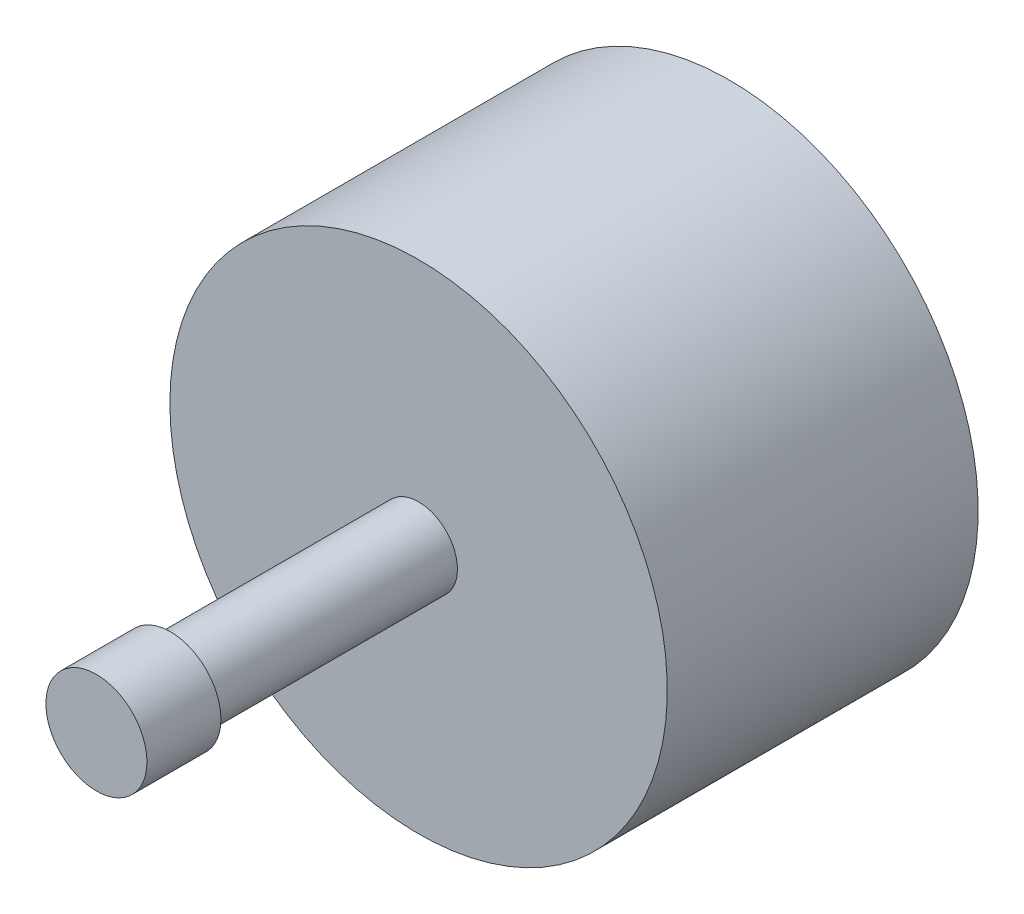
ISO-10303-21;
HEADER;
FILE_DESCRIPTION(('STEP AP214'),'2;1');
FILE_NAME('part.step','',(''),(''),'','','');
FILE_SCHEMA(('AUTOMOTIVE_DESIGN { 1 0 10303 214 1 1 1 1 }'));
ENDSEC;
DATA;
#1=APPLICATION_CONTEXT('core data for automotive mechanical design processes');
#2=APPLICATION_PROTOCOL_DEFINITION('international standard','automotive_design',2000,#1);
#3=PRODUCT_CONTEXT('',#1,'mechanical');
#4=PRODUCT('Part','Part','',(#3));
#5=PRODUCT_RELATED_PRODUCT_CATEGORY('part','',(#4));
#6=PRODUCT_DEFINITION_FORMATION('','',#4);
#7=PRODUCT_DEFINITION_CONTEXT('part definition',#1,'design');
#8=PRODUCT_DEFINITION('design','',#6,#7);
#9=PRODUCT_DEFINITION_SHAPE('','',#8);
#10=(LENGTH_UNIT() NAMED_UNIT(*) SI_UNIT(.MILLI.,.METRE.));
#11=(NAMED_UNIT(*) PLANE_ANGLE_UNIT() SI_UNIT($,.RADIAN.));
#12=(NAMED_UNIT(*) SI_UNIT($,.STERADIAN.) SOLID_ANGLE_UNIT());
#13=UNCERTAINTY_MEASURE_WITH_UNIT(LENGTH_MEASURE(1.E-05),#10,'distance_accuracy_value','');
#14=(GEOMETRIC_REPRESENTATION_CONTEXT(3) GLOBAL_UNCERTAINTY_ASSIGNED_CONTEXT((#13)) GLOBAL_UNIT_ASSIGNED_CONTEXT((#10,
#11,#12)) REPRESENTATION_CONTEXT('',''));
#15=CARTESIAN_POINT('',(0.,0.,0.));
#16=DIRECTION('',(0.,0.,1.));
#17=DIRECTION('',(1.,0.,0.));
#18=AXIS2_PLACEMENT_3D('',#15,#16,#17);
#19=CARTESIAN_POINT('',(0.,0.,15.965));
#20=DIRECTION('',(0.,0.,-1.));
#21=DIRECTION('',(-1.,0.,0.));
#22=AXIS2_PLACEMENT_3D('',#19,#20,#21);
#23=CYLINDRICAL_SURFACE('',#22,2.5);
#24=CARTESIAN_POINT('',(0.,0.,15.965));
#25=DIRECTION('',(0.,0.,1.));
#26=DIRECTION('',(1.,0.,0.));
#27=AXIS2_PLACEMENT_3D('',#24,#25,#26);
#28=CIRCLE('',#27,2.5);
#29=CARTESIAN_POINT('',(2.5,0.,15.965));
#30=VERTEX_POINT('',#29);
#31=EDGE_CURVE('E10',#30,#30,#28,.T.);
#32=ORIENTED_EDGE('',*,*,#31,.F.);
#33=EDGE_LOOP('',(#32));
#34=FACE_BOUND('',#33,.T.);
#35=CARTESIAN_POINT('',(0.,0.,0.));
#36=DIRECTION('',(0.,0.,1.));
#37=DIRECTION('',(1.,0.,0.));
#38=AXIS2_PLACEMENT_3D('',#35,#36,#37);
#39=CIRCLE('',#38,2.5);
#40=CARTESIAN_POINT('',(2.5,0.,0.));
#41=VERTEX_POINT('',#40);
#42=EDGE_CURVE('E34',#41,#41,#39,.T.);
#43=ORIENTED_EDGE('',*,*,#42,.T.);
#44=EDGE_LOOP('',(#43));
#45=FACE_BOUND('',#44,.T.);
#46=ADVANCED_FACE('F31',(#34,#45),#23,.T.);
#47=CARTESIAN_POINT('',(0.,0.,20.725));
#48=DIRECTION('',(0.,0.,-1.));
#49=DIRECTION('',(-1.,0.,0.));
#50=AXIS2_PLACEMENT_3D('',#47,#48,#49);
#51=CYLINDRICAL_SURFACE('',#50,3.25);
#52=CARTESIAN_POINT('',(0.,0.,20.725));
#53=DIRECTION('',(0.,0.,1.));
#54=DIRECTION('',(1.,0.,0.));
#55=AXIS2_PLACEMENT_3D('',#52,#53,#54);
#56=CIRCLE('',#55,3.25);
#57=CARTESIAN_POINT('',(3.25,0.,20.725));
#58=VERTEX_POINT('',#57);
#59=EDGE_CURVE('E38',#58,#58,#56,.T.);
#60=ORIENTED_EDGE('',*,*,#59,.F.);
#61=EDGE_LOOP('',(#60));
#62=FACE_BOUND('',#61,.T.);
#63=CARTESIAN_POINT('',(0.,0.,15.965));
#64=DIRECTION('',(0.,0.,1.));
#65=DIRECTION('',(1.,0.,0.));
#66=AXIS2_PLACEMENT_3D('',#63,#64,#65);
#67=CIRCLE('',#66,3.25);
#68=CARTESIAN_POINT('',(3.25,0.,15.965));
#69=VERTEX_POINT('',#68);
#70=EDGE_CURVE('E42',#69,#69,#67,.T.);
#71=ORIENTED_EDGE('',*,*,#70,.T.);
#72=EDGE_LOOP('',(#71));
#73=FACE_BOUND('',#72,.T.);
#74=ADVANCED_FACE('F79',(#62,#73),#51,.T.);
#75=CARTESIAN_POINT('',(0.,0.,20.725));
#76=DIRECTION('',(0.,0.,1.));
#77=DIRECTION('',(1.,0.,0.));
#78=AXIS2_PLACEMENT_3D('',#75,#76,#77);
#79=PLANE('',#78);
#80=ORIENTED_EDGE('',*,*,#59,.T.);
#81=EDGE_LOOP('',(#80));
#82=FACE_BOUND('',#81,.T.);
#83=ADVANCED_FACE('F75',(#82),#79,.T.);
#84=CARTESIAN_POINT('',(0.,0.,15.965));
#85=DIRECTION('',(0.,0.,1.));
#86=DIRECTION('',(1.,0.,0.));
#87=AXIS2_PLACEMENT_3D('',#84,#85,#86);
#88=PLANE('',#87);
#89=ORIENTED_EDGE('',*,*,#31,.T.);
#90=EDGE_LOOP('',(#89));
#91=FACE_BOUND('',#90,.T.);
#92=ORIENTED_EDGE('',*,*,#70,.F.);
#93=EDGE_LOOP('',(#92));
#94=FACE_BOUND('',#93,.T.);
#95=ADVANCED_FACE('F67',(#91,#94),#88,.F.);
#96=CARTESIAN_POINT('',(0.,0.,-20.));
#97=DIRECTION('',(0.,0.,1.));
#98=DIRECTION('',(1.,0.,0.));
#99=AXIS2_PLACEMENT_3D('',#96,#97,#98);
#100=CYLINDRICAL_SURFACE('',#99,16.);
#101=CARTESIAN_POINT('',(0.,0.,-20.));
#102=DIRECTION('',(0.,0.,-1.));
#103=DIRECTION('',(-1.,0.,0.));
#104=AXIS2_PLACEMENT_3D('',#101,#102,#103);
#105=CIRCLE('',#104,16.);
#106=CARTESIAN_POINT('',(-16.,0.,-20.));
#107=VERTEX_POINT('',#106);
#108=EDGE_CURVE('E50',#107,#107,#105,.T.);
#109=ORIENTED_EDGE('',*,*,#108,.F.);
#110=EDGE_LOOP('',(#109));
#111=FACE_BOUND('',#110,.T.);
#112=CARTESIAN_POINT('',(0.,0.,0.));
#113=DIRECTION('',(0.,0.,-1.));
#114=DIRECTION('',(-1.,0.,0.));
#115=AXIS2_PLACEMENT_3D('',#112,#113,#114);
#116=CIRCLE('',#115,16.);
#117=CARTESIAN_POINT('',(-16.,0.,0.));
#118=VERTEX_POINT('',#117);
#119=EDGE_CURVE('E47',#118,#118,#116,.T.);
#120=ORIENTED_EDGE('',*,*,#119,.T.);
#121=EDGE_LOOP('',(#120));
#122=FACE_BOUND('',#121,.T.);
#123=ADVANCED_FACE('F65',(#111,#122),#100,.T.);
#124=CARTESIAN_POINT('',(0.,0.,-20.));
#125=DIRECTION('',(0.,0.,-1.));
#126=DIRECTION('',(-1.,0.,0.));
#127=AXIS2_PLACEMENT_3D('',#124,#125,#126);
#128=PLANE('',#127);
#129=ORIENTED_EDGE('',*,*,#108,.T.);
#130=EDGE_LOOP('',(#129));
#131=FACE_BOUND('',#130,.T.);
#132=ADVANCED_FACE('F61',(#131),#128,.T.);
#133=CARTESIAN_POINT('',(0.,0.,0.));
#134=DIRECTION('',(0.,0.,-1.));
#135=DIRECTION('',(-1.,0.,0.));
#136=AXIS2_PLACEMENT_3D('',#133,#134,#135);
#137=PLANE('',#136);
#138=ORIENTED_EDGE('',*,*,#42,.F.);
#139=EDGE_LOOP('',(#138));
#140=FACE_BOUND('',#139,.T.);
#141=ORIENTED_EDGE('',*,*,#119,.F.);
#142=EDGE_LOOP('',(#141));
#143=FACE_BOUND('',#142,.T.);
#144=ADVANCED_FACE('F58',(#140,#143),#137,.F.);
#145=CLOSED_SHELL('',(#46,#74,#83,#95,#123,#132,#144));
#146=MANIFOLD_SOLID_BREP('B2',#145);
#147=ADVANCED_BREP_SHAPE_REPRESENTATION('',(#18,#146),#14);
#148=SHAPE_DEFINITION_REPRESENTATION(#9,#147);
ENDSEC;
END-ISO-10303-21;
